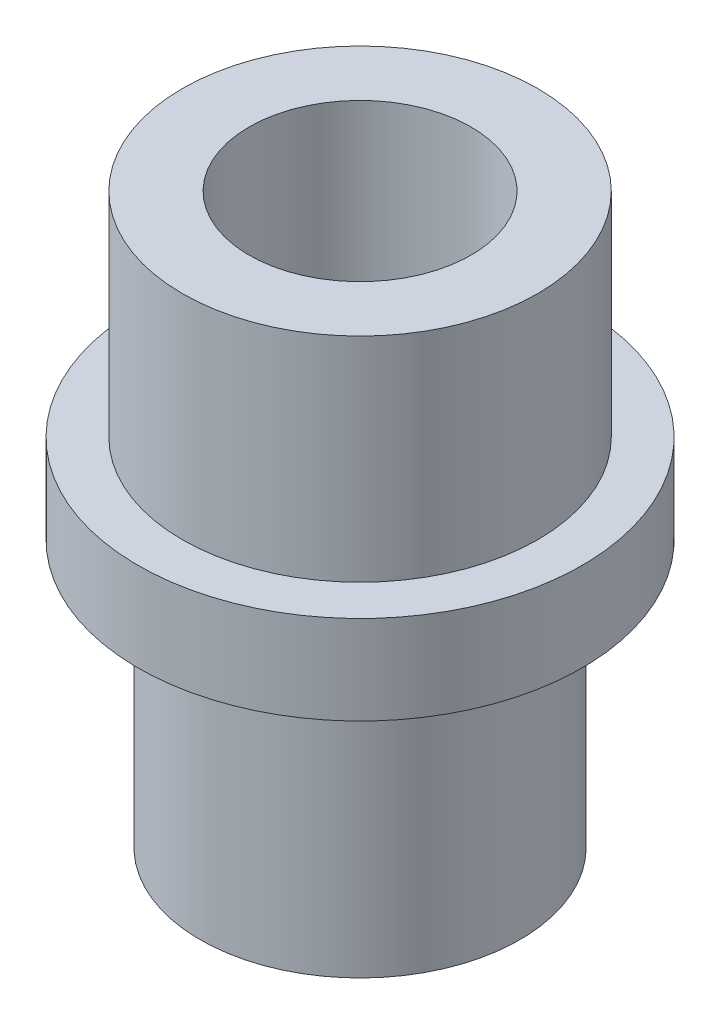
ISO-10303-21;
HEADER;
FILE_DESCRIPTION(('STEP AP214'),'2;1');
FILE_NAME('part.step','',(''),(''),'','','');
FILE_SCHEMA(('AUTOMOTIVE_DESIGN { 1 0 10303 214 1 1 1 1 }'));
ENDSEC;
DATA;
#1=APPLICATION_CONTEXT('core data for automotive mechanical design processes');
#2=APPLICATION_PROTOCOL_DEFINITION('international standard','automotive_design',2000,#1);
#3=PRODUCT_CONTEXT('',#1,'mechanical');
#4=PRODUCT('Part','Part','',(#3));
#5=PRODUCT_RELATED_PRODUCT_CATEGORY('part','',(#4));
#6=PRODUCT_DEFINITION_FORMATION('','',#4);
#7=PRODUCT_DEFINITION_CONTEXT('part definition',#1,'design');
#8=PRODUCT_DEFINITION('design','',#6,#7);
#9=PRODUCT_DEFINITION_SHAPE('','',#8);
#10=(LENGTH_UNIT() NAMED_UNIT(*) SI_UNIT(.MILLI.,.METRE.));
#11=(NAMED_UNIT(*) PLANE_ANGLE_UNIT() SI_UNIT($,.RADIAN.));
#12=(NAMED_UNIT(*) SI_UNIT($,.STERADIAN.) SOLID_ANGLE_UNIT());
#13=UNCERTAINTY_MEASURE_WITH_UNIT(LENGTH_MEASURE(1.E-05),#10,'distance_accuracy_value','');
#14=(GEOMETRIC_REPRESENTATION_CONTEXT(3) GLOBAL_UNCERTAINTY_ASSIGNED_CONTEXT((#13)) GLOBAL_UNIT_ASSIGNED_CONTEXT((#10,
#11,#12)) REPRESENTATION_CONTEXT('',''));
#15=CARTESIAN_POINT('',(0.,0.,0.));
#16=DIRECTION('',(0.,0.,1.));
#17=DIRECTION('',(1.,0.,0.));
#18=AXIS2_PLACEMENT_3D('',#15,#16,#17);
#19=CARTESIAN_POINT('',(0.,13.9100264842874,0.));
#20=DIRECTION('',(0.,1.,0.));
#21=DIRECTION('',(-1.,0.,0.));
#22=AXIS2_PLACEMENT_3D('',#19,#20,#21);
#23=CYLINDRICAL_SURFACE('',#22,1.8);
#24=CARTESIAN_POINT('',(0.,3.,0.));
#25=DIRECTION('',(0.,1.,0.));
#26=DIRECTION('',(-1.,0.,0.));
#27=AXIS2_PLACEMENT_3D('',#24,#25,#26);
#28=CIRCLE('',#27,1.8);
#29=CARTESIAN_POINT('',(-1.8,3.,0.));
#30=VERTEX_POINT('',#29);
#31=EDGE_CURVE('E80',#30,#30,#28,.T.);
#32=ORIENTED_EDGE('',*,*,#31,.F.);
#33=EDGE_LOOP('',(#32));
#34=FACE_BOUND('',#33,.T.);
#35=CARTESIAN_POINT('',(0.,0.,0.));
#36=DIRECTION('',(0.,1.,0.));
#37=DIRECTION('',(-1.,0.,0.));
#38=AXIS2_PLACEMENT_3D('',#35,#36,#37);
#39=CIRCLE('',#38,1.8);
#40=CARTESIAN_POINT('',(-1.8,0.,0.));
#41=VERTEX_POINT('',#40);
#42=EDGE_CURVE('E10',#41,#41,#39,.T.);
#43=ORIENTED_EDGE('',*,*,#42,.T.);
#44=EDGE_LOOP('',(#43));
#45=FACE_BOUND('',#44,.T.);
#46=ADVANCED_FACE('F37',(#34,#45),#23,.T.);
#47=CARTESIAN_POINT('',(1.,0.,0.));
#48=DIRECTION('',(0.,1.,0.));
#49=DIRECTION('',(-1.,0.,0.));
#50=AXIS2_PLACEMENT_3D('',#47,#48,#49);
#51=PLANE('',#50);
#52=ORIENTED_EDGE('',*,*,#42,.F.);
#53=EDGE_LOOP('',(#52));
#54=FACE_BOUND('',#53,.T.);
#55=CARTESIAN_POINT('',(0.,0.,0.));
#56=DIRECTION('',(0.,1.,0.));
#57=DIRECTION('',(-1.,0.,0.));
#58=AXIS2_PLACEMENT_3D('',#55,#56,#57);
#59=CIRCLE('',#58,1.);
#60=CARTESIAN_POINT('',(-0.999999999999998,0.,0.));
#61=VERTEX_POINT('',#60);
#62=EDGE_CURVE('E44',#61,#61,#59,.T.);
#63=ORIENTED_EDGE('',*,*,#62,.T.);
#64=EDGE_LOOP('',(#63));
#65=FACE_BOUND('',#64,.T.);
#66=ADVANCED_FACE('F88',(#54,#65),#51,.F.);
#67=CARTESIAN_POINT('',(0.,13.9100264842874,0.));
#68=DIRECTION('',(0.,1.,0.));
#69=DIRECTION('',(-1.,0.,0.));
#70=AXIS2_PLACEMENT_3D('',#67,#68,#69);
#71=CYLINDRICAL_SURFACE('',#70,1.);
#72=ORIENTED_EDGE('',*,*,#62,.F.);
#73=EDGE_LOOP('',(#72));
#74=FACE_BOUND('',#73,.T.);
#75=CARTESIAN_POINT('',(0.,0.5,0.));
#76=DIRECTION('',(0.,1.,0.));
#77=DIRECTION('',(-1.,0.,0.));
#78=AXIS2_PLACEMENT_3D('',#75,#76,#77);
#79=CIRCLE('',#78,1.);
#80=CARTESIAN_POINT('',(-0.999999999999999,0.5,0.));
#81=VERTEX_POINT('',#80);
#82=EDGE_CURVE('E49',#81,#81,#79,.T.);
#83=ORIENTED_EDGE('',*,*,#82,.T.);
#84=EDGE_LOOP('',(#83));
#85=FACE_BOUND('',#84,.T.);
#86=ADVANCED_FACE('F92',(#74,#85),#71,.F.);
#87=CARTESIAN_POINT('',(0.,0.5,0.));
#88=DIRECTION('',(0.,1.,0.));
#89=DIRECTION('',(-1.,0.,0.));
#90=AXIS2_PLACEMENT_3D('',#87,#88,#89);
#91=PLANE('',#90);
#92=ORIENTED_EDGE('',*,*,#82,.F.);
#93=EDGE_LOOP('',(#92));
#94=FACE_BOUND('',#93,.T.);
#95=ADVANCED_FACE('F97',(#94),#91,.F.);
#96=CARTESIAN_POINT('',(1.25,2.4,0.));
#97=DIRECTION('',(0.,-1.,0.));
#98=DIRECTION('',(1.,0.,0.));
#99=AXIS2_PLACEMENT_3D('',#96,#97,#98);
#100=PLANE('',#99);
#101=CARTESIAN_POINT('',(0.,2.4,0.));
#102=DIRECTION('',(0.,1.,0.));
#103=DIRECTION('',(-1.,0.,0.));
#104=AXIS2_PLACEMENT_3D('',#101,#102,#103);
#105=CIRCLE('',#104,1.25);
#106=CARTESIAN_POINT('',(-1.25,2.4,0.));
#107=VERTEX_POINT('',#106);
#108=EDGE_CURVE('E54',#107,#107,#105,.T.);
#109=ORIENTED_EDGE('',*,*,#108,.T.);
#110=EDGE_LOOP('',(#109));
#111=FACE_BOUND('',#110,.T.);
#112=ADVANCED_FACE('F103',(#111),#100,.F.);
#113=CARTESIAN_POINT('',(0.,13.9100264842874,0.));
#114=DIRECTION('',(0.,1.,0.));
#115=DIRECTION('',(-1.,0.,0.));
#116=AXIS2_PLACEMENT_3D('',#113,#114,#115);
#117=CYLINDRICAL_SURFACE('',#116,1.25);
#118=ORIENTED_EDGE('',*,*,#108,.F.);
#119=EDGE_LOOP('',(#118));
#120=FACE_BOUND('',#119,.T.);
#121=CARTESIAN_POINT('',(0.,6.4,0.));
#122=DIRECTION('',(0.,1.,0.));
#123=DIRECTION('',(-1.,0.,0.));
#124=AXIS2_PLACEMENT_3D('',#121,#122,#123);
#125=CIRCLE('',#124,1.25);
#126=CARTESIAN_POINT('',(-1.25,6.4,0.));
#127=VERTEX_POINT('',#126);
#128=EDGE_CURVE('E60',#127,#127,#125,.T.);
#129=ORIENTED_EDGE('',*,*,#128,.T.);
#130=EDGE_LOOP('',(#129));
#131=FACE_BOUND('',#130,.T.);
#132=ADVANCED_FACE('F107',(#120,#131),#117,.F.);
#133=CARTESIAN_POINT('',(2.,6.4,0.));
#134=DIRECTION('',(0.,-1.,0.));
#135=DIRECTION('',(1.,0.,0.));
#136=AXIS2_PLACEMENT_3D('',#133,#134,#135);
#137=PLANE('',#136);
#138=ORIENTED_EDGE('',*,*,#128,.F.);
#139=EDGE_LOOP('',(#138));
#140=FACE_BOUND('',#139,.T.);
#141=CARTESIAN_POINT('',(0.,6.4,0.));
#142=DIRECTION('',(0.,1.,0.));
#143=DIRECTION('',(-1.,0.,0.));
#144=AXIS2_PLACEMENT_3D('',#141,#142,#143);
#145=CIRCLE('',#144,2.);
#146=CARTESIAN_POINT('',(-2.,6.4,0.));
#147=VERTEX_POINT('',#146);
#148=EDGE_CURVE('E64',#147,#147,#145,.T.);
#149=ORIENTED_EDGE('',*,*,#148,.T.);
#150=EDGE_LOOP('',(#149));
#151=FACE_BOUND('',#150,.T.);
#152=ADVANCED_FACE('F111',(#140,#151),#137,.F.);
#153=CARTESIAN_POINT('',(0.,13.9100264842874,0.));
#154=DIRECTION('',(0.,1.,0.));
#155=DIRECTION('',(-1.,0.,0.));
#156=AXIS2_PLACEMENT_3D('',#153,#154,#155);
#157=CYLINDRICAL_SURFACE('',#156,2.);
#158=ORIENTED_EDGE('',*,*,#148,.F.);
#159=EDGE_LOOP('',(#158));
#160=FACE_BOUND('',#159,.T.);
#161=CARTESIAN_POINT('',(0.,4.,0.));
#162=DIRECTION('',(0.,1.,0.));
#163=DIRECTION('',(-1.,0.,0.));
#164=AXIS2_PLACEMENT_3D('',#161,#162,#163);
#165=CIRCLE('',#164,2.);
#166=CARTESIAN_POINT('',(-2.,4.,0.));
#167=VERTEX_POINT('',#166);
#168=EDGE_CURVE('E68',#167,#167,#165,.T.);
#169=ORIENTED_EDGE('',*,*,#168,.T.);
#170=EDGE_LOOP('',(#169));
#171=FACE_BOUND('',#170,.T.);
#172=ADVANCED_FACE('F115',(#160,#171),#157,.T.);
#173=CARTESIAN_POINT('',(2.5,4.,0.));
#174=DIRECTION('',(0.,-1.,0.));
#175=DIRECTION('',(1.,0.,0.));
#176=AXIS2_PLACEMENT_3D('',#173,#174,#175);
#177=PLANE('',#176);
#178=ORIENTED_EDGE('',*,*,#168,.F.);
#179=EDGE_LOOP('',(#178));
#180=FACE_BOUND('',#179,.T.);
#181=CARTESIAN_POINT('',(0.,4.,0.));
#182=DIRECTION('',(0.,1.,0.));
#183=DIRECTION('',(-1.,0.,0.));
#184=AXIS2_PLACEMENT_3D('',#181,#182,#183);
#185=CIRCLE('',#184,2.5);
#186=CARTESIAN_POINT('',(-2.5,4.,0.));
#187=VERTEX_POINT('',#186);
#188=EDGE_CURVE('E72',#187,#187,#185,.T.);
#189=ORIENTED_EDGE('',*,*,#188,.T.);
#190=EDGE_LOOP('',(#189));
#191=FACE_BOUND('',#190,.T.);
#192=ADVANCED_FACE('F119',(#180,#191),#177,.F.);
#193=CARTESIAN_POINT('',(0.,13.9100264842874,0.));
#194=DIRECTION('',(0.,1.,0.));
#195=DIRECTION('',(-1.,0.,0.));
#196=AXIS2_PLACEMENT_3D('',#193,#194,#195);
#197=CYLINDRICAL_SURFACE('',#196,2.5);
#198=ORIENTED_EDGE('',*,*,#188,.F.);
#199=EDGE_LOOP('',(#198));
#200=FACE_BOUND('',#199,.T.);
#201=CARTESIAN_POINT('',(0.,3.,0.));
#202=DIRECTION('',(0.,1.,0.));
#203=DIRECTION('',(-1.,0.,0.));
#204=AXIS2_PLACEMENT_3D('',#201,#202,#203);
#205=CIRCLE('',#204,2.5);
#206=CARTESIAN_POINT('',(-2.5,3.,0.));
#207=VERTEX_POINT('',#206);
#208=EDGE_CURVE('E76',#207,#207,#205,.T.);
#209=ORIENTED_EDGE('',*,*,#208,.T.);
#210=EDGE_LOOP('',(#209));
#211=FACE_BOUND('',#210,.T.);
#212=ADVANCED_FACE('F123',(#200,#211),#197,.T.);
#213=CARTESIAN_POINT('',(1.8,3.,0.));
#214=DIRECTION('',(0.,1.,0.));
#215=DIRECTION('',(-1.,0.,0.));
#216=AXIS2_PLACEMENT_3D('',#213,#214,#215);
#217=PLANE('',#216);
#218=ORIENTED_EDGE('',*,*,#208,.F.);
#219=EDGE_LOOP('',(#218));
#220=FACE_BOUND('',#219,.T.);
#221=ORIENTED_EDGE('',*,*,#31,.T.);
#222=EDGE_LOOP('',(#221));
#223=FACE_BOUND('',#222,.T.);
#224=ADVANCED_FACE('F85',(#220,#223),#217,.F.);
#225=CLOSED_SHELL('',(#46,#66,#86,#95,#112,#132,#152,#172,#192,#212,#224));
#226=MANIFOLD_SOLID_BREP('B2',#225);
#227=ADVANCED_BREP_SHAPE_REPRESENTATION('',(#18,#226),#14);
#228=SHAPE_DEFINITION_REPRESENTATION(#9,#227);
ENDSEC;
END-ISO-10303-21;
